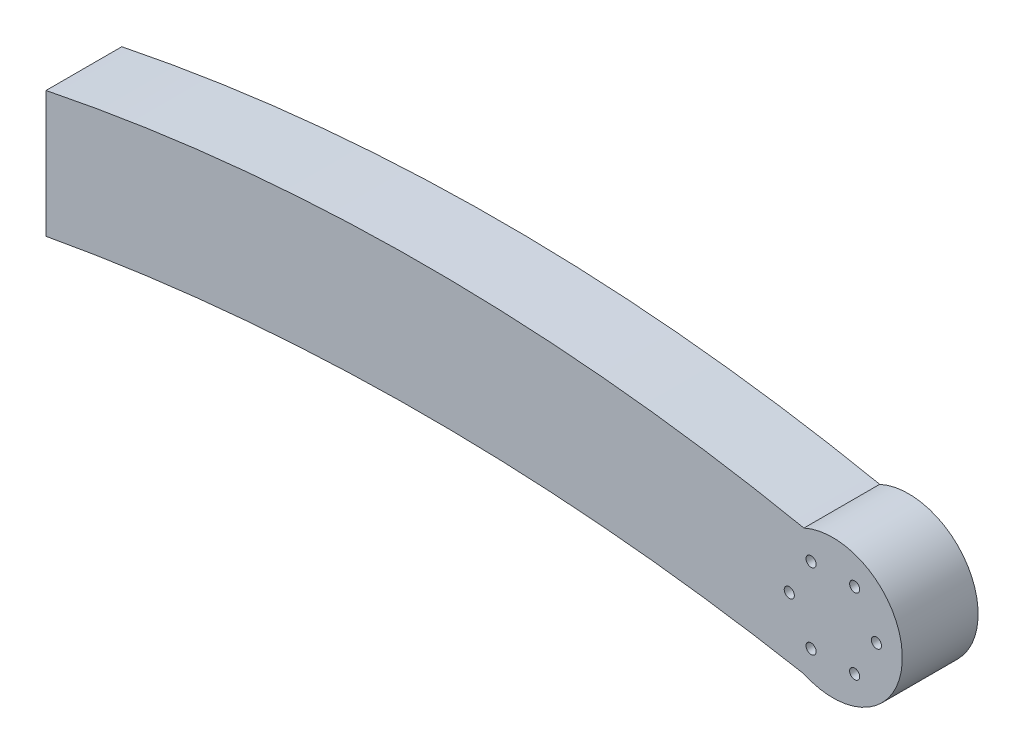
ISO-10303-21;
HEADER;
FILE_DESCRIPTION(('STEP AP214'),'2;1');
FILE_NAME('part.step','',(''),(''),'','','');
FILE_SCHEMA(('AUTOMOTIVE_DESIGN { 1 0 10303 214 1 1 1 1 }'));
ENDSEC;
DATA;
#1=APPLICATION_CONTEXT('core data for automotive mechanical design processes');
#2=APPLICATION_PROTOCOL_DEFINITION('international standard','automotive_design',2000,#1);
#3=PRODUCT_CONTEXT('',#1,'mechanical');
#4=PRODUCT('Part','Part','',(#3));
#5=PRODUCT_RELATED_PRODUCT_CATEGORY('part','',(#4));
#6=PRODUCT_DEFINITION_FORMATION('','',#4);
#7=PRODUCT_DEFINITION_CONTEXT('part definition',#1,'design');
#8=PRODUCT_DEFINITION('design','',#6,#7);
#9=PRODUCT_DEFINITION_SHAPE('','',#8);
#10=(LENGTH_UNIT() NAMED_UNIT(*) SI_UNIT(.MILLI.,.METRE.));
#11=(NAMED_UNIT(*) PLANE_ANGLE_UNIT() SI_UNIT($,.RADIAN.));
#12=(NAMED_UNIT(*) SI_UNIT($,.STERADIAN.) SOLID_ANGLE_UNIT());
#13=UNCERTAINTY_MEASURE_WITH_UNIT(LENGTH_MEASURE(1.E-05),#10,'distance_accuracy_value','');
#14=(GEOMETRIC_REPRESENTATION_CONTEXT(3) GLOBAL_UNCERTAINTY_ASSIGNED_CONTEXT((#13)) GLOBAL_UNIT_ASSIGNED_CONTEXT((#10,
#11,#12)) REPRESENTATION_CONTEXT('',''));
#15=CARTESIAN_POINT('',(0.,0.,0.));
#16=DIRECTION('',(0.,0.,1.));
#17=DIRECTION('',(1.,0.,0.));
#18=AXIS2_PLACEMENT_3D('',#15,#16,#17);
#19=CARTESIAN_POINT('',(0.,-709.846922834953,30.));
#20=DIRECTION('',(0.,0.,-1.));
#21=DIRECTION('',(-1.,0.,0.));
#22=AXIS2_PLACEMENT_3D('',#19,#20,#21);
#23=CYLINDRICAL_SURFACE('',#22,750.);
#24=CARTESIAN_POINT('',(0.,-709.846922834953,0.));
#25=DIRECTION('',(0.,0.,1.));
#26=DIRECTION('',(1.,0.,0.));
#27=AXIS2_PLACEMENT_3D('',#24,#25,#26);
#28=CIRCLE('',#27,750.);
#29=CARTESIAN_POINT('',(-150.,25.,0.));
#30=VERTEX_POINT('',#29);
#31=CARTESIAN_POINT('',(150.,25.,0.));
#32=VERTEX_POINT('',#31);
#33=EDGE_CURVE('E117',#30,#32,#28,.F.);
#34=ORIENTED_EDGE('',*,*,#33,.F.);
#35=DIRECTION('',(0.,0.,-1.));
#36=VECTOR('',#35,1.);
#37=CARTESIAN_POINT('',(-150.,25.,30.));
#38=LINE('',#37,#36);
#39=CARTESIAN_POINT('',(-150.,25.,30.));
#40=VERTEX_POINT('',#39);
#41=EDGE_CURVE('E75',#40,#30,#38,.T.);
#42=ORIENTED_EDGE('',*,*,#41,.F.);
#43=CARTESIAN_POINT('',(0.,-709.846922834953,30.));
#44=DIRECTION('',(0.,0.,1.));
#45=DIRECTION('',(1.,0.,0.));
#46=AXIS2_PLACEMENT_3D('',#43,#44,#45);
#47=CIRCLE('',#46,750.);
#48=CARTESIAN_POINT('',(150.,25.,30.));
#49=VERTEX_POINT('',#48);
#50=EDGE_CURVE('E115',#40,#49,#47,.F.);
#51=ORIENTED_EDGE('',*,*,#50,.T.);
#52=DIRECTION('',(0.,0.,-1.));
#53=VECTOR('',#52,1.);
#54=CARTESIAN_POINT('',(150.,25.,30.));
#55=LINE('',#54,#53);
#56=EDGE_CURVE('E12',#49,#32,#55,.T.);
#57=ORIENTED_EDGE('',*,*,#56,.T.);
#58=EDGE_LOOP('',(#34,#42,#51,#57));
#59=FACE_BOUND('',#58,.T.);
#60=ADVANCED_FACE('F65',(#59),#23,.T.);
#61=CARTESIAN_POINT('',(-150.,0.,30.));
#62=DIRECTION('',(1.,0.,0.));
#63=DIRECTION('',(0.,0.,-1.));
#64=AXIS2_PLACEMENT_3D('',#61,#62,#63);
#65=PLANE('',#64);
#66=DIRECTION('',(0.,-1.,0.));
#67=VECTOR('',#66,1.);
#68=CARTESIAN_POINT('',(-150.,0.,0.));
#69=LINE('',#68,#67);
#70=CARTESIAN_POINT('',(-150.,-25.,0.));
#71=VERTEX_POINT('',#70);
#72=EDGE_CURVE('E100',#30,#71,#69,.T.);
#73=ORIENTED_EDGE('',*,*,#72,.T.);
#74=DIRECTION('',(0.,0.,-1.));
#75=VECTOR('',#74,1.);
#76=CARTESIAN_POINT('',(-150.,-25.,30.));
#77=LINE('',#76,#75);
#78=CARTESIAN_POINT('',(-150.,-25.,30.));
#79=VERTEX_POINT('',#78);
#80=EDGE_CURVE('E118',#79,#71,#77,.T.);
#81=ORIENTED_EDGE('',*,*,#80,.F.);
#82=DIRECTION('',(0.,-1.,0.));
#83=VECTOR('',#82,1.);
#84=CARTESIAN_POINT('',(-150.,0.,30.));
#85=LINE('',#84,#83);
#86=EDGE_CURVE('E120',#40,#79,#85,.T.);
#87=ORIENTED_EDGE('',*,*,#86,.F.);
#88=ORIENTED_EDGE('',*,*,#41,.T.);
#89=EDGE_LOOP('',(#73,#81,#87,#88));
#90=FACE_BOUND('',#89,.T.);
#91=ADVANCED_FACE('F121',(#90),#65,.F.);
#92=CARTESIAN_POINT('',(0.,-836.194612038024,30.));
#93=DIRECTION('',(0.,0.,-1.));
#94=DIRECTION('',(-1.,0.,0.));
#95=AXIS2_PLACEMENT_3D('',#92,#93,#94);
#96=CYLINDRICAL_SURFACE('',#95,824.946482263862);
#97=CARTESIAN_POINT('',(0.,-836.194612038024,0.));
#98=DIRECTION('',(0.,0.,1.));
#99=DIRECTION('',(1.,0.,0.));
#100=AXIS2_PLACEMENT_3D('',#97,#98,#99);
#101=CIRCLE('',#100,824.946482263862);
#102=CARTESIAN_POINT('',(150.,-25.,0.));
#103=VERTEX_POINT('',#102);
#104=EDGE_CURVE('E128',#71,#103,#101,.F.);
#105=ORIENTED_EDGE('',*,*,#104,.T.);
#106=DIRECTION('',(0.,0.,-1.));
#107=VECTOR('',#106,1.);
#108=CARTESIAN_POINT('',(150.,-25.,30.));
#109=LINE('',#108,#107);
#110=CARTESIAN_POINT('',(150.,-25.,30.));
#111=VERTEX_POINT('',#110);
#112=EDGE_CURVE('E84',#111,#103,#109,.T.);
#113=ORIENTED_EDGE('',*,*,#112,.F.);
#114=CARTESIAN_POINT('',(0.,-836.194612038024,30.));
#115=DIRECTION('',(0.,0.,1.));
#116=DIRECTION('',(1.,0.,0.));
#117=AXIS2_PLACEMENT_3D('',#114,#115,#116);
#118=CIRCLE('',#117,824.946482263862);
#119=EDGE_CURVE('E124',#79,#111,#118,.F.);
#120=ORIENTED_EDGE('',*,*,#119,.F.);
#121=ORIENTED_EDGE('',*,*,#80,.T.);
#122=EDGE_LOOP('',(#105,#113,#120,#121));
#123=FACE_BOUND('',#122,.T.);
#124=ADVANCED_FACE('F201',(#123),#96,.F.);
#125=CARTESIAN_POINT('',(0.,0.,0.));
#126=DIRECTION('',(0.,0.,1.));
#127=DIRECTION('',(1.,0.,0.));
#128=AXIS2_PLACEMENT_3D('',#125,#126,#127);
#129=PLANE('',#128);
#130=CARTESIAN_POINT('',(170.08143923739,14.9389382152814,0.));
#131=DIRECTION('',(0.,0.,1.));
#132=DIRECTION('',(1.,0.,0.));
#133=AXIS2_PLACEMENT_3D('',#130,#131,#132);
#134=CIRCLE('',#133,2.);
#135=CARTESIAN_POINT('',(172.08143923739,14.9389382152814,0.));
#136=VERTEX_POINT('',#135);
#137=EDGE_CURVE('E146',#136,#136,#134,.T.);
#138=ORIENTED_EDGE('',*,*,#137,.T.);
#139=EDGE_LOOP('',(#138));
#140=FACE_BOUND('',#139,.T.);
#141=CARTESIAN_POINT('',(178.70643923739,0.,0.));
#142=DIRECTION('',(0.,0.,1.));
#143=DIRECTION('',(1.,0.,0.));
#144=AXIS2_PLACEMENT_3D('',#141,#142,#143);
#145=CIRCLE('',#144,2.);
#146=CARTESIAN_POINT('',(180.70643923739,0.,0.));
#147=VERTEX_POINT('',#146);
#148=EDGE_CURVE('E152',#147,#147,#145,.T.);
#149=ORIENTED_EDGE('',*,*,#148,.T.);
#150=EDGE_LOOP('',(#149));
#151=FACE_BOUND('',#150,.T.);
#152=CARTESIAN_POINT('',(170.08143923739,-14.9389382152816,0.));
#153=DIRECTION('',(0.,0.,1.));
#154=DIRECTION('',(1.,0.,0.));
#155=AXIS2_PLACEMENT_3D('',#152,#153,#154);
#156=CIRCLE('',#155,2.);
#157=CARTESIAN_POINT('',(172.08143923739,-14.9389382152816,0.));
#158=VERTEX_POINT('',#157);
#159=EDGE_CURVE('E158',#158,#158,#156,.T.);
#160=ORIENTED_EDGE('',*,*,#159,.T.);
#161=EDGE_LOOP('',(#160));
#162=FACE_BOUND('',#161,.T.);
#163=CARTESIAN_POINT('',(152.83143923739,-14.9389382152815,0.));
#164=DIRECTION('',(0.,0.,1.));
#165=DIRECTION('',(1.,0.,0.));
#166=AXIS2_PLACEMENT_3D('',#163,#164,#165);
#167=CIRCLE('',#166,2.);
#168=CARTESIAN_POINT('',(154.83143923739,-14.9389382152815,0.));
#169=VERTEX_POINT('',#168);
#170=EDGE_CURVE('E164',#169,#169,#167,.T.);
#171=ORIENTED_EDGE('',*,*,#170,.T.);
#172=EDGE_LOOP('',(#171));
#173=FACE_BOUND('',#172,.T.);
#174=CARTESIAN_POINT('',(144.20643923739,1.24681137647146E-13,0.));
#175=DIRECTION('',(0.,0.,1.));
#176=DIRECTION('',(1.,0.,0.));
#177=AXIS2_PLACEMENT_3D('',#174,#175,#176);
#178=CIRCLE('',#177,1.99999999999999);
#179=CARTESIAN_POINT('',(146.20643923739,1.24681137647146E-13,0.));
#180=VERTEX_POINT('',#179);
#181=EDGE_CURVE('E170',#180,#180,#178,.T.);
#182=ORIENTED_EDGE('',*,*,#181,.T.);
#183=EDGE_LOOP('',(#182));
#184=FACE_BOUND('',#183,.T.);
#185=CARTESIAN_POINT('',(152.83143923739,14.9389382152816,0.));
#186=DIRECTION('',(0.,0.,1.));
#187=DIRECTION('',(1.,0.,0.));
#188=AXIS2_PLACEMENT_3D('',#185,#186,#187);
#189=CIRCLE('',#188,2.);
#190=CARTESIAN_POINT('',(154.83143923739,14.9389382152816,0.));
#191=VERTEX_POINT('',#190);
#192=EDGE_CURVE('E139',#191,#191,#189,.T.);
#193=ORIENTED_EDGE('',*,*,#192,.T.);
#194=EDGE_LOOP('',(#193));
#195=FACE_BOUND('',#194,.T.);
#196=ORIENTED_EDGE('',*,*,#33,.T.);
#197=CARTESIAN_POINT('',(161.45643923739,0.,0.));
#198=DIRECTION('',(0.,0.,1.));
#199=DIRECTION('',(1.,0.,0.));
#200=AXIS2_PLACEMENT_3D('',#197,#198,#199);
#201=CIRCLE('',#200,27.5);
#202=EDGE_CURVE('E69',#103,#32,#201,.T.);
#203=ORIENTED_EDGE('',*,*,#202,.F.);
#204=ORIENTED_EDGE('',*,*,#104,.F.);
#205=ORIENTED_EDGE('',*,*,#72,.F.);
#206=EDGE_LOOP('',(#196,#203,#204,#205));
#207=FACE_BOUND('',#206,.T.);
#208=ADVANCED_FACE('F180',(#140,#151,#162,#173,#184,#195,#207),#129,.F.);
#209=CARTESIAN_POINT('',(0.,0.,30.));
#210=DIRECTION('',(0.,0.,1.));
#211=DIRECTION('',(1.,0.,0.));
#212=AXIS2_PLACEMENT_3D('',#209,#210,#211);
#213=PLANE('',#212);
#214=CARTESIAN_POINT('',(170.08143923739,14.9389382152814,30.));
#215=DIRECTION('',(0.,0.,1.));
#216=DIRECTION('',(1.,0.,0.));
#217=AXIS2_PLACEMENT_3D('',#214,#215,#216);
#218=CIRCLE('',#217,2.);
#219=CARTESIAN_POINT('',(172.08143923739,14.9389382152814,30.));
#220=VERTEX_POINT('',#219);
#221=EDGE_CURVE('E149',#220,#220,#218,.T.);
#222=ORIENTED_EDGE('',*,*,#221,.F.);
#223=EDGE_LOOP('',(#222));
#224=FACE_BOUND('',#223,.T.);
#225=CARTESIAN_POINT('',(178.70643923739,0.,30.));
#226=DIRECTION('',(0.,0.,1.));
#227=DIRECTION('',(1.,0.,0.));
#228=AXIS2_PLACEMENT_3D('',#225,#226,#227);
#229=CIRCLE('',#228,2.);
#230=CARTESIAN_POINT('',(180.70643923739,0.,30.));
#231=VERTEX_POINT('',#230);
#232=EDGE_CURVE('E155',#231,#231,#229,.T.);
#233=ORIENTED_EDGE('',*,*,#232,.F.);
#234=EDGE_LOOP('',(#233));
#235=FACE_BOUND('',#234,.T.);
#236=CARTESIAN_POINT('',(170.08143923739,-14.9389382152816,30.));
#237=DIRECTION('',(0.,0.,1.));
#238=DIRECTION('',(1.,0.,0.));
#239=AXIS2_PLACEMENT_3D('',#236,#237,#238);
#240=CIRCLE('',#239,2.);
#241=CARTESIAN_POINT('',(172.08143923739,-14.9389382152816,30.));
#242=VERTEX_POINT('',#241);
#243=EDGE_CURVE('E161',#242,#242,#240,.T.);
#244=ORIENTED_EDGE('',*,*,#243,.F.);
#245=EDGE_LOOP('',(#244));
#246=FACE_BOUND('',#245,.T.);
#247=CARTESIAN_POINT('',(152.83143923739,-14.9389382152815,30.));
#248=DIRECTION('',(0.,0.,1.));
#249=DIRECTION('',(1.,0.,0.));
#250=AXIS2_PLACEMENT_3D('',#247,#248,#249);
#251=CIRCLE('',#250,2.);
#252=CARTESIAN_POINT('',(154.83143923739,-14.9389382152815,30.));
#253=VERTEX_POINT('',#252);
#254=EDGE_CURVE('E167',#253,#253,#251,.T.);
#255=ORIENTED_EDGE('',*,*,#254,.F.);
#256=EDGE_LOOP('',(#255));
#257=FACE_BOUND('',#256,.T.);
#258=CARTESIAN_POINT('',(144.20643923739,1.24681137647146E-13,30.));
#259=DIRECTION('',(0.,0.,1.));
#260=DIRECTION('',(1.,0.,0.));
#261=AXIS2_PLACEMENT_3D('',#258,#259,#260);
#262=CIRCLE('',#261,1.99999999999999);
#263=CARTESIAN_POINT('',(146.20643923739,1.24681137647146E-13,30.));
#264=VERTEX_POINT('',#263);
#265=EDGE_CURVE('E144',#264,#264,#262,.T.);
#266=ORIENTED_EDGE('',*,*,#265,.F.);
#267=EDGE_LOOP('',(#266));
#268=FACE_BOUND('',#267,.T.);
#269=CARTESIAN_POINT('',(152.83143923739,14.9389382152816,30.));
#270=DIRECTION('',(0.,0.,1.));
#271=DIRECTION('',(1.,0.,0.));
#272=AXIS2_PLACEMENT_3D('',#269,#270,#271);
#273=CIRCLE('',#272,2.);
#274=CARTESIAN_POINT('',(154.83143923739,14.9389382152816,30.));
#275=VERTEX_POINT('',#274);
#276=EDGE_CURVE('E132',#275,#275,#273,.T.);
#277=ORIENTED_EDGE('',*,*,#276,.F.);
#278=EDGE_LOOP('',(#277));
#279=FACE_BOUND('',#278,.T.);
#280=ORIENTED_EDGE('',*,*,#119,.T.);
#281=CARTESIAN_POINT('',(161.45643923739,0.,30.));
#282=DIRECTION('',(0.,0.,1.));
#283=DIRECTION('',(1.,0.,0.));
#284=AXIS2_PLACEMENT_3D('',#281,#282,#283);
#285=CIRCLE('',#284,27.5);
#286=EDGE_CURVE('E127',#111,#49,#285,.T.);
#287=ORIENTED_EDGE('',*,*,#286,.T.);
#288=ORIENTED_EDGE('',*,*,#50,.F.);
#289=ORIENTED_EDGE('',*,*,#86,.T.);
#290=EDGE_LOOP('',(#280,#287,#288,#289));
#291=FACE_BOUND('',#290,.T.);
#292=ADVANCED_FACE('F126',(#224,#235,#246,#257,#268,#279,#291),#213,.T.);
#293=CARTESIAN_POINT('',(161.45643923739,0.,30.));
#294=DIRECTION('',(0.,0.,-1.));
#295=DIRECTION('',(-1.,0.,0.));
#296=AXIS2_PLACEMENT_3D('',#293,#294,#295);
#297=CYLINDRICAL_SURFACE('',#296,27.5);
#298=ORIENTED_EDGE('',*,*,#202,.T.);
#299=ORIENTED_EDGE('',*,*,#56,.F.);
#300=ORIENTED_EDGE('',*,*,#286,.F.);
#301=ORIENTED_EDGE('',*,*,#112,.T.);
#302=EDGE_LOOP('',(#298,#299,#300,#301));
#303=FACE_BOUND('',#302,.T.);
#304=ADVANCED_FACE('F67',(#303),#297,.T.);
#305=CARTESIAN_POINT('',(152.83143923739,14.9389382152816,0.));
#306=DIRECTION('',(0.,0.,1.));
#307=DIRECTION('',(1.,0.,0.));
#308=AXIS2_PLACEMENT_3D('',#305,#306,#307);
#309=CYLINDRICAL_SURFACE('',#308,2.);
#310=ORIENTED_EDGE('',*,*,#192,.F.);
#311=EDGE_LOOP('',(#310));
#312=FACE_BOUND('',#311,.T.);
#313=ORIENTED_EDGE('',*,*,#276,.T.);
#314=EDGE_LOOP('',(#313));
#315=FACE_BOUND('',#314,.T.);
#316=ADVANCED_FACE('F185',(#312,#315),#309,.F.);
#317=CARTESIAN_POINT('',(144.20643923739,1.24681137647146E-13,0.));
#318=DIRECTION('',(0.,0.,1.));
#319=DIRECTION('',(1.,0.,0.));
#320=AXIS2_PLACEMENT_3D('',#317,#318,#319);
#321=CYLINDRICAL_SURFACE('',#320,1.99999999999999);
#322=ORIENTED_EDGE('',*,*,#181,.F.);
#323=EDGE_LOOP('',(#322));
#324=FACE_BOUND('',#323,.T.);
#325=ORIENTED_EDGE('',*,*,#265,.T.);
#326=EDGE_LOOP('',(#325));
#327=FACE_BOUND('',#326,.T.);
#328=ADVANCED_FACE('F176',(#324,#327),#321,.F.);
#329=CARTESIAN_POINT('',(152.83143923739,-14.9389382152815,0.));
#330=DIRECTION('',(0.,0.,1.));
#331=DIRECTION('',(1.,0.,0.));
#332=AXIS2_PLACEMENT_3D('',#329,#330,#331);
#333=CYLINDRICAL_SURFACE('',#332,2.);
#334=ORIENTED_EDGE('',*,*,#170,.F.);
#335=EDGE_LOOP('',(#334));
#336=FACE_BOUND('',#335,.T.);
#337=ORIENTED_EDGE('',*,*,#254,.T.);
#338=EDGE_LOOP('',(#337));
#339=FACE_BOUND('',#338,.T.);
#340=ADVANCED_FACE('F192',(#336,#339),#333,.F.);
#341=CARTESIAN_POINT('',(170.08143923739,-14.9389382152816,0.));
#342=DIRECTION('',(0.,0.,1.));
#343=DIRECTION('',(1.,0.,0.));
#344=AXIS2_PLACEMENT_3D('',#341,#342,#343);
#345=CYLINDRICAL_SURFACE('',#344,2.);
#346=ORIENTED_EDGE('',*,*,#159,.F.);
#347=EDGE_LOOP('',(#346));
#348=FACE_BOUND('',#347,.T.);
#349=ORIENTED_EDGE('',*,*,#243,.T.);
#350=EDGE_LOOP('',(#349));
#351=FACE_BOUND('',#350,.T.);
#352=ADVANCED_FACE('F224',(#348,#351),#345,.F.);
#353=CARTESIAN_POINT('',(178.70643923739,0.,0.));
#354=DIRECTION('',(0.,0.,1.));
#355=DIRECTION('',(1.,0.,0.));
#356=AXIS2_PLACEMENT_3D('',#353,#354,#355);
#357=CYLINDRICAL_SURFACE('',#356,2.);
#358=ORIENTED_EDGE('',*,*,#148,.F.);
#359=EDGE_LOOP('',(#358));
#360=FACE_BOUND('',#359,.T.);
#361=ORIENTED_EDGE('',*,*,#232,.T.);
#362=EDGE_LOOP('',(#361));
#363=FACE_BOUND('',#362,.T.);
#364=ADVANCED_FACE('F231',(#360,#363),#357,.F.);
#365=CARTESIAN_POINT('',(170.08143923739,14.9389382152814,0.));
#366=DIRECTION('',(0.,0.,1.));
#367=DIRECTION('',(1.,0.,0.));
#368=AXIS2_PLACEMENT_3D('',#365,#366,#367);
#369=CYLINDRICAL_SURFACE('',#368,2.);
#370=ORIENTED_EDGE('',*,*,#137,.F.);
#371=EDGE_LOOP('',(#370));
#372=FACE_BOUND('',#371,.T.);
#373=ORIENTED_EDGE('',*,*,#221,.T.);
#374=EDGE_LOOP('',(#373));
#375=FACE_BOUND('',#374,.T.);
#376=ADVANCED_FACE('F236',(#372,#375),#369,.F.);
#377=CLOSED_SHELL('',(#60,#91,#124,#208,#292,#304,#316,#328,#340,#352,#364,#376));
#378=MANIFOLD_SOLID_BREP('B2',#377);
#379=ADVANCED_BREP_SHAPE_REPRESENTATION('',(#18,#378),#14);
#380=SHAPE_DEFINITION_REPRESENTATION(#9,#379);
ENDSEC;
END-ISO-10303-21;
